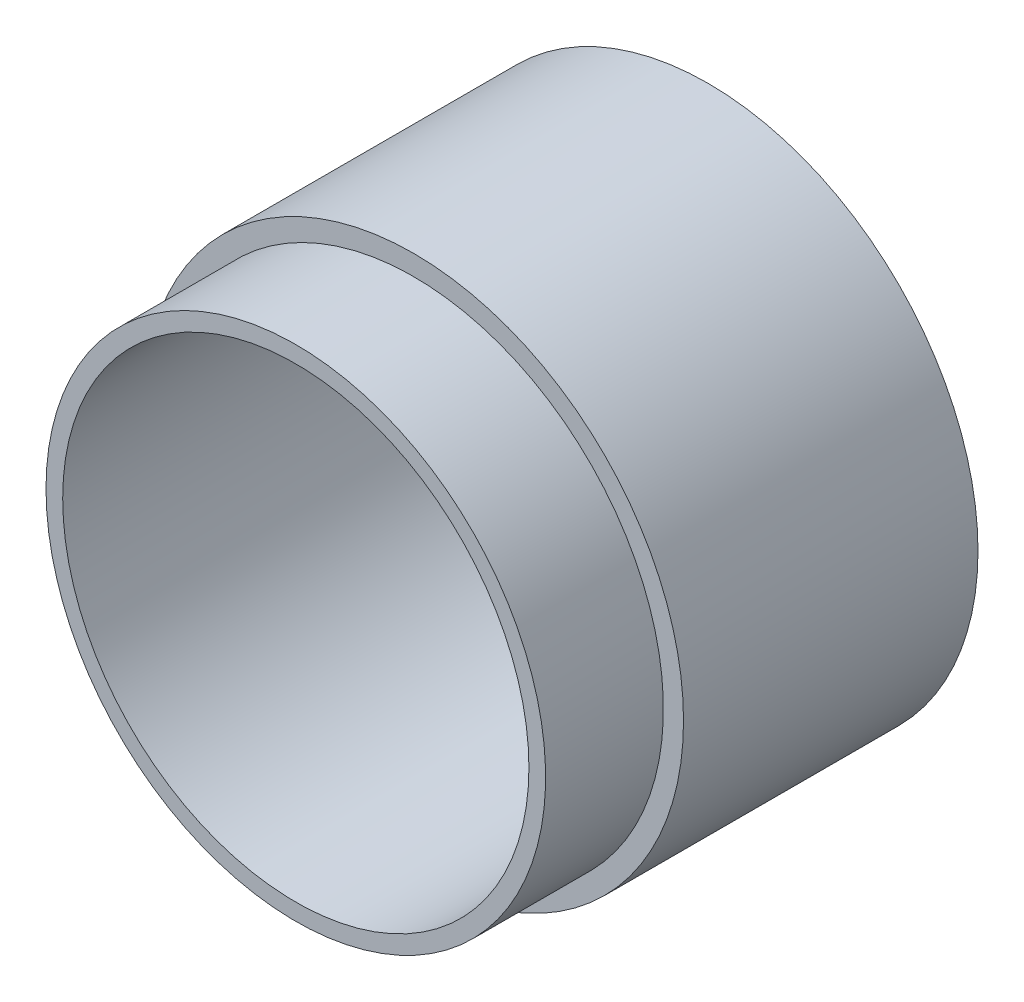
ISO-10303-21;
HEADER;
FILE_DESCRIPTION(('STEP AP214'),'2;1');
FILE_NAME('part.step','',(''),(''),'','','');
FILE_SCHEMA(('AUTOMOTIVE_DESIGN { 1 0 10303 214 1 1 1 1 }'));
ENDSEC;
DATA;
#1=APPLICATION_CONTEXT('core data for automotive mechanical design processes');
#2=APPLICATION_PROTOCOL_DEFINITION('international standard','automotive_design',2000,#1);
#3=PRODUCT_CONTEXT('',#1,'mechanical');
#4=PRODUCT('Part','Part','',(#3));
#5=PRODUCT_RELATED_PRODUCT_CATEGORY('part','',(#4));
#6=PRODUCT_DEFINITION_FORMATION('','',#4);
#7=PRODUCT_DEFINITION_CONTEXT('part definition',#1,'design');
#8=PRODUCT_DEFINITION('design','',#6,#7);
#9=PRODUCT_DEFINITION_SHAPE('','',#8);
#10=(LENGTH_UNIT() NAMED_UNIT(*) SI_UNIT(.MILLI.,.METRE.));
#11=(NAMED_UNIT(*) PLANE_ANGLE_UNIT() SI_UNIT($,.RADIAN.));
#12=(NAMED_UNIT(*) SI_UNIT($,.STERADIAN.) SOLID_ANGLE_UNIT());
#13=UNCERTAINTY_MEASURE_WITH_UNIT(LENGTH_MEASURE(1.E-05),#10,'distance_accuracy_value','');
#14=(GEOMETRIC_REPRESENTATION_CONTEXT(3) GLOBAL_UNCERTAINTY_ASSIGNED_CONTEXT((#13)) GLOBAL_UNIT_ASSIGNED_CONTEXT((#10,
#11,#12)) REPRESENTATION_CONTEXT('',''));
#15=CARTESIAN_POINT('',(0.,0.,0.));
#16=DIRECTION('',(0.,0.,1.));
#17=DIRECTION('',(1.,0.,0.));
#18=AXIS2_PLACEMENT_3D('',#15,#16,#17);
#19=CARTESIAN_POINT('',(0.,0.,15.24));
#20=DIRECTION('',(0.,0.,1.));
#21=DIRECTION('',(1.,0.,0.));
#22=AXIS2_PLACEMENT_3D('',#19,#20,#21);
#23=PLANE('',#22);
#24=CARTESIAN_POINT('',(0.,0.,15.24));
#25=DIRECTION('',(0.,0.,1.));
#26=DIRECTION('',(1.,0.,0.));
#27=AXIS2_PLACEMENT_3D('',#24,#25,#26);
#28=CIRCLE('',#27,13.97);
#29=CARTESIAN_POINT('',(-13.97,0.,15.24));
#30=VERTEX_POINT('',#29);
#31=EDGE_CURVE('E10',#30,#30,#28,.T.);
#32=ORIENTED_EDGE('',*,*,#31,.T.);
#33=EDGE_LOOP('',(#32));
#34=FACE_BOUND('',#33,.T.);
#35=CARTESIAN_POINT('',(0.,0.,15.24));
#36=DIRECTION('',(0.,0.,1.));
#37=DIRECTION('',(1.,0.,0.));
#38=AXIS2_PLACEMENT_3D('',#35,#36,#37);
#39=CIRCLE('',#38,12.9286);
#40=CARTESIAN_POINT('',(-12.9286,0.,15.24));
#41=VERTEX_POINT('',#40);
#42=EDGE_CURVE('E68',#41,#41,#39,.T.);
#43=ORIENTED_EDGE('',*,*,#42,.F.);
#44=EDGE_LOOP('',(#43));
#45=FACE_BOUND('',#44,.T.);
#46=ADVANCED_FACE('F43',(#34,#45),#23,.T.);
#47=CARTESIAN_POINT('',(0.,0.,15.24));
#48=DIRECTION('',(0.,0.,-1.));
#49=DIRECTION('',(-1.,0.,0.));
#50=AXIS2_PLACEMENT_3D('',#47,#48,#49);
#51=CYLINDRICAL_SURFACE('',#50,12.065);
#52=CARTESIAN_POINT('',(0.,0.,1.27));
#53=DIRECTION('',(0.,0.,-1.));
#54=DIRECTION('',(-1.,0.,0.));
#55=AXIS2_PLACEMENT_3D('',#52,#53,#54);
#56=CIRCLE('',#55,12.065);
#57=CARTESIAN_POINT('',(-12.065,0.,1.27));
#58=VERTEX_POINT('',#57);
#59=EDGE_CURVE('E47',#58,#58,#56,.T.);
#60=CARTESIAN_POINT('',(0.,0.,21.336));
#61=DIRECTION('',(0.,0.,1.));
#62=DIRECTION('',(1.,0.,0.));
#63=AXIS2_PLACEMENT_3D('',#60,#61,#62);
#64=CIRCLE('',#63,12.065);
#65=CARTESIAN_POINT('',(-12.065,0.,21.336));
#66=VERTEX_POINT('',#65);
#67=EDGE_CURVE('E72',#66,#66,#64,.T.);
#68=CARTESIAN_POINT('',(-12.065,0.,1.27));
#69=CARTESIAN_POINT('',(-12.065,0.,1.47902083333333));
#70=CARTESIAN_POINT('',(-12.065,0.,1.68804166666667));
#71=CARTESIAN_POINT('',(-12.065,0.,2.10608333333333));
#72=CARTESIAN_POINT('',(-12.065,0.,2.31510416666667));
#73=CARTESIAN_POINT('',(-12.065,0.,2.73314583333333));
#74=CARTESIAN_POINT('',(-12.065,0.,2.94216666666667));
#75=CARTESIAN_POINT('',(-12.065,0.,3.36020833333333));
#76=CARTESIAN_POINT('',(-12.065,0.,3.56922916666667));
#77=CARTESIAN_POINT('',(-12.065,0.,3.98727083333333));
#78=CARTESIAN_POINT('',(-12.065,0.,4.19629166666667));
#79=CARTESIAN_POINT('',(-12.065,0.,4.61433333333333));
#80=CARTESIAN_POINT('',(-12.065,0.,4.82335416666667));
#81=CARTESIAN_POINT('',(-12.065,0.,5.24139583333333));
#82=CARTESIAN_POINT('',(-12.065,0.,5.45041666666667));
#83=CARTESIAN_POINT('',(-12.065,0.,5.86845833333333));
#84=CARTESIAN_POINT('',(-12.065,0.,6.07747916666667));
#85=CARTESIAN_POINT('',(-12.065,0.,6.49552083333333));
#86=CARTESIAN_POINT('',(-12.065,0.,6.70454166666667));
#87=CARTESIAN_POINT('',(-12.065,0.,7.12258333333333));
#88=CARTESIAN_POINT('',(-12.065,0.,7.33160416666667));
#89=CARTESIAN_POINT('',(-12.065,0.,7.74964583333333));
#90=CARTESIAN_POINT('',(-12.065,0.,7.95866666666667));
#91=CARTESIAN_POINT('',(-12.065,0.,8.37670833333333));
#92=CARTESIAN_POINT('',(-12.065,0.,8.58572916666667));
#93=CARTESIAN_POINT('',(-12.065,0.,9.00377083333333));
#94=CARTESIAN_POINT('',(-12.065,0.,9.21279166666667));
#95=CARTESIAN_POINT('',(-12.065,0.,9.63083333333333));
#96=CARTESIAN_POINT('',(-12.065,0.,9.83985416666667));
#97=CARTESIAN_POINT('',(-12.065,0.,10.2578958333333));
#98=CARTESIAN_POINT('',(-12.065,0.,10.4669166666667));
#99=CARTESIAN_POINT('',(-12.065,0.,10.8849583333333));
#100=CARTESIAN_POINT('',(-12.065,0.,11.0939791666667));
#101=CARTESIAN_POINT('',(-12.065,0.,11.5120208333333));
#102=CARTESIAN_POINT('',(-12.065,0.,11.7210416666667));
#103=CARTESIAN_POINT('',(-12.065,0.,12.1390833333333));
#104=CARTESIAN_POINT('',(-12.065,0.,12.3481041666667));
#105=CARTESIAN_POINT('',(-12.065,0.,12.7661458333333));
#106=CARTESIAN_POINT('',(-12.065,0.,12.9751666666667));
#107=CARTESIAN_POINT('',(-12.065,0.,13.3932083333333));
#108=CARTESIAN_POINT('',(-12.065,0.,13.6022291666667));
#109=CARTESIAN_POINT('',(-12.065,0.,14.0202708333333));
#110=CARTESIAN_POINT('',(-12.065,0.,14.2292916666667));
#111=CARTESIAN_POINT('',(-12.065,0.,14.6473333333333));
#112=CARTESIAN_POINT('',(-12.065,0.,14.8563541666667));
#113=CARTESIAN_POINT('',(-12.065,0.,15.2743958333333));
#114=CARTESIAN_POINT('',(-12.065,0.,15.4834166666667));
#115=CARTESIAN_POINT('',(-12.065,0.,15.9014583333333));
#116=CARTESIAN_POINT('',(-12.065,0.,16.1104791666667));
#117=CARTESIAN_POINT('',(-12.065,0.,16.5285208333333));
#118=CARTESIAN_POINT('',(-12.065,0.,16.7375416666667));
#119=CARTESIAN_POINT('',(-12.065,0.,17.1555833333333));
#120=CARTESIAN_POINT('',(-12.065,0.,17.3646041666667));
#121=CARTESIAN_POINT('',(-12.065,0.,17.7826458333333));
#122=CARTESIAN_POINT('',(-12.065,0.,17.9916666666667));
#123=CARTESIAN_POINT('',(-12.065,0.,18.4097083333333));
#124=CARTESIAN_POINT('',(-12.065,0.,18.6187291666667));
#125=CARTESIAN_POINT('',(-12.065,0.,19.0367708333333));
#126=CARTESIAN_POINT('',(-12.065,0.,19.2457916666667));
#127=CARTESIAN_POINT('',(-12.065,0.,19.6638333333333));
#128=CARTESIAN_POINT('',(-12.065,0.,19.8728541666667));
#129=CARTESIAN_POINT('',(-12.065,0.,20.2908958333333));
#130=CARTESIAN_POINT('',(-12.065,0.,20.4999166666667));
#131=CARTESIAN_POINT('',(-12.065,0.,20.9179583333333));
#132=CARTESIAN_POINT('',(-12.065,0.,21.1269791666667));
#133=CARTESIAN_POINT('',(-12.065,0.,21.336));
#134=B_SPLINE_CURVE_WITH_KNOTS('',3,(#68,#69,#70,#71,#72,#73,#74,#75,#76,#77,#78,#79,#80,#81,
#82,#83,#84,#85,#86,#87,#88,#89,#90,#91,#92,#93,#94,#95,#96,#97,#98,#99,#100,#101,#102,#103,
#104,#105,#106,#107,#108,#109,#110,#111,#112,#113,#114,#115,#116,#117,#118,#119,#120,#121,#122,
#123,#124,#125,#126,#127,#128,#129,#130,#131,#132,#133),.UNSPECIFIED.,.F.,.F.,(4,2,2,2,2,2,2,2,
2,2,2,2,2,2,2,2,2,2,2,2,2,2,2,2,2,2,2,2,2,2,2,2,4),(0.,0.627062500000001,1.254125,1.8811875,
2.50825,3.1353125,3.762375,4.3894375,5.0165,5.6435625,6.270625,6.8976875,7.52475,8.1518125,
8.778875,9.4059375,10.033,10.6600625,11.287125,11.9141875,12.54125,13.1683125,13.795375,
14.4224375,15.0495,15.6765625,16.303625,16.9306875,17.55775,18.1848125,18.811875,19.4389375,
20.066),.UNSPECIFIED.);
#135=EDGE_CURVE('BSEAM80',#58,#66,#134,.T.);
#136=ORIENTED_EDGE('',*,*,#59,.T.);
#137=ORIENTED_EDGE('',*,*,#67,.T.);
#138=ORIENTED_EDGE('',*,*,#135,.T.);
#139=ORIENTED_EDGE('',*,*,#135,.F.);
#140=EDGE_LOOP('',(#136,#138,#137,#139));
#141=FACE_BOUND('',#140,.T.);
#142=ADVANCED_FACE('F80',(#141),#51,.F.);
#143=CARTESIAN_POINT('',(0.,0.,0.));
#144=DIRECTION('',(0.,0.,1.));
#145=DIRECTION('',(1.,0.,0.));
#146=AXIS2_PLACEMENT_3D('',#143,#144,#145);
#147=PLANE('',#146);
#148=CARTESIAN_POINT('',(0.,0.,0.));
#149=DIRECTION('',(0.,0.,1.));
#150=DIRECTION('',(1.,0.,0.));
#151=AXIS2_PLACEMENT_3D('',#148,#149,#150);
#152=CIRCLE('',#151,13.97);
#153=CARTESIAN_POINT('',(-13.97,0.,0.));
#154=VERTEX_POINT('',#153);
#155=EDGE_CURVE('E52',#154,#154,#152,.T.);
#156=ORIENTED_EDGE('',*,*,#155,.F.);
#157=EDGE_LOOP('',(#156));
#158=FACE_BOUND('',#157,.T.);
#159=CARTESIAN_POINT('',(0.,0.,0.));
#160=DIRECTION('',(0.,0.,-1.));
#161=DIRECTION('',(-1.,0.,0.));
#162=AXIS2_PLACEMENT_3D('',#159,#160,#161);
#163=CIRCLE('',#162,3.175);
#164=CARTESIAN_POINT('',(-3.175,0.,0.));
#165=VERTEX_POINT('',#164);
#166=EDGE_CURVE('E59',#165,#165,#163,.T.);
#167=ORIENTED_EDGE('',*,*,#166,.F.);
#168=EDGE_LOOP('',(#167));
#169=FACE_BOUND('',#168,.T.);
#170=ADVANCED_FACE('F102',(#158,#169),#147,.F.);
#171=CARTESIAN_POINT('',(0.,0.,15.24));
#172=DIRECTION('',(0.,0.,-1.));
#173=DIRECTION('',(-1.,0.,0.));
#174=AXIS2_PLACEMENT_3D('',#171,#172,#173);
#175=CYLINDRICAL_SURFACE('',#174,13.97);
#176=CARTESIAN_POINT('',(-13.97,0.,0.));
#177=CARTESIAN_POINT('',(-13.97,0.,0.15875));
#178=CARTESIAN_POINT('',(-13.97,0.,0.3175));
#179=CARTESIAN_POINT('',(-13.97,0.,0.635));
#180=CARTESIAN_POINT('',(-13.97,0.,0.79375));
#181=CARTESIAN_POINT('',(-13.97,0.,1.11125));
#182=CARTESIAN_POINT('',(-13.97,0.,1.27));
#183=CARTESIAN_POINT('',(-13.97,0.,1.5875));
#184=CARTESIAN_POINT('',(-13.97,0.,1.74625));
#185=CARTESIAN_POINT('',(-13.97,0.,2.06375));
#186=CARTESIAN_POINT('',(-13.97,0.,2.2225));
#187=CARTESIAN_POINT('',(-13.97,0.,2.54));
#188=CARTESIAN_POINT('',(-13.97,0.,2.69875));
#189=CARTESIAN_POINT('',(-13.97,0.,3.01625));
#190=CARTESIAN_POINT('',(-13.97,0.,3.175));
#191=CARTESIAN_POINT('',(-13.97,0.,3.4925));
#192=CARTESIAN_POINT('',(-13.97,0.,3.65125));
#193=CARTESIAN_POINT('',(-13.97,0.,3.96875));
#194=CARTESIAN_POINT('',(-13.97,0.,4.1275));
#195=CARTESIAN_POINT('',(-13.97,0.,4.445));
#196=CARTESIAN_POINT('',(-13.97,0.,4.60375));
#197=CARTESIAN_POINT('',(-13.97,0.,4.92125));
#198=CARTESIAN_POINT('',(-13.97,0.,5.08));
#199=CARTESIAN_POINT('',(-13.97,0.,5.3975));
#200=CARTESIAN_POINT('',(-13.97,0.,5.55625));
#201=CARTESIAN_POINT('',(-13.97,0.,5.87375));
#202=CARTESIAN_POINT('',(-13.97,0.,6.0325));
#203=CARTESIAN_POINT('',(-13.97,0.,6.35));
#204=CARTESIAN_POINT('',(-13.97,0.,6.50875));
#205=CARTESIAN_POINT('',(-13.97,0.,6.82625));
#206=CARTESIAN_POINT('',(-13.97,0.,6.985));
#207=CARTESIAN_POINT('',(-13.97,0.,7.3025));
#208=CARTESIAN_POINT('',(-13.97,0.,7.46125));
#209=CARTESIAN_POINT('',(-13.97,0.,7.77875));
#210=CARTESIAN_POINT('',(-13.97,0.,7.9375));
#211=CARTESIAN_POINT('',(-13.97,0.,8.255));
#212=CARTESIAN_POINT('',(-13.97,0.,8.41375));
#213=CARTESIAN_POINT('',(-13.97,0.,8.73125));
#214=CARTESIAN_POINT('',(-13.97,0.,8.89));
#215=CARTESIAN_POINT('',(-13.97,0.,9.2075));
#216=CARTESIAN_POINT('',(-13.97,0.,9.36625));
#217=CARTESIAN_POINT('',(-13.97,0.,9.68375));
#218=CARTESIAN_POINT('',(-13.97,0.,9.8425));
#219=CARTESIAN_POINT('',(-13.97,0.,10.16));
#220=CARTESIAN_POINT('',(-13.97,0.,10.31875));
#221=CARTESIAN_POINT('',(-13.97,0.,10.63625));
#222=CARTESIAN_POINT('',(-13.97,0.,10.795));
#223=CARTESIAN_POINT('',(-13.97,0.,11.1125));
#224=CARTESIAN_POINT('',(-13.97,0.,11.27125));
#225=CARTESIAN_POINT('',(-13.97,0.,11.58875));
#226=CARTESIAN_POINT('',(-13.97,0.,11.7475));
#227=CARTESIAN_POINT('',(-13.97,0.,12.065));
#228=CARTESIAN_POINT('',(-13.97,0.,12.22375));
#229=CARTESIAN_POINT('',(-13.97,0.,12.54125));
#230=CARTESIAN_POINT('',(-13.97,0.,12.7));
#231=CARTESIAN_POINT('',(-13.97,0.,13.0175));
#232=CARTESIAN_POINT('',(-13.97,0.,13.17625));
#233=CARTESIAN_POINT('',(-13.97,0.,13.49375));
#234=CARTESIAN_POINT('',(-13.97,0.,13.6525));
#235=CARTESIAN_POINT('',(-13.97,0.,13.97));
#236=CARTESIAN_POINT('',(-13.97,0.,14.12875));
#237=CARTESIAN_POINT('',(-13.97,0.,14.44625));
#238=CARTESIAN_POINT('',(-13.97,0.,14.605));
#239=CARTESIAN_POINT('',(-13.97,0.,14.9225));
#240=CARTESIAN_POINT('',(-13.97,0.,15.08125));
#241=CARTESIAN_POINT('',(-13.97,0.,15.24));
#242=B_SPLINE_CURVE_WITH_KNOTS('',3,(#176,#177,#178,#179,#180,#181,#182,#183,#184,#185,#186,
#187,#188,#189,#190,#191,#192,#193,#194,#195,#196,#197,#198,#199,#200,#201,#202,#203,#204,#205,
#206,#207,#208,#209,#210,#211,#212,#213,#214,#215,#216,#217,#218,#219,#220,#221,#222,#223,#224,
#225,#226,#227,#228,#229,#230,#231,#232,#233,#234,#235,#236,#237,#238,#239,#240,#241),
.UNSPECIFIED.,.F.,.F.,(4,2,2,2,2,2,2,2,2,2,2,2,2,2,2,2,2,2,2,2,2,2,2,2,2,2,2,2,2,2,2,2,4),(0.,
0.476249999999999,0.9525,1.42875,1.905,2.38125,2.8575,3.33375,3.81,4.28625,4.7625,5.23875,5.715,
6.19125,6.6675,7.14375,7.62,8.09625,8.5725,9.04875,9.525,10.00125,10.4775,10.95375,11.43,
11.90625,12.3825,12.85875,13.335,13.81125,14.2875,14.76375,15.24),.UNSPECIFIED.);
#243=EDGE_CURVE('BSEAM45',#154,#30,#242,.T.);
#244=ORIENTED_EDGE('',*,*,#155,.T.);
#245=ORIENTED_EDGE('',*,*,#31,.F.);
#246=ORIENTED_EDGE('',*,*,#243,.T.);
#247=ORIENTED_EDGE('',*,*,#243,.F.);
#248=EDGE_LOOP('',(#244,#246,#245,#247));
#249=FACE_BOUND('',#248,.T.);
#250=ADVANCED_FACE('F45',(#249),#175,.T.);
#251=CARTESIAN_POINT('',(0.,0.,1.27));
#252=DIRECTION('',(0.,0.,-1.));
#253=DIRECTION('',(-1.,0.,0.));
#254=AXIS2_PLACEMENT_3D('',#251,#252,#253);
#255=PLANE('',#254);
#256=CARTESIAN_POINT('',(0.,0.,1.27));
#257=DIRECTION('',(0.,0.,-1.));
#258=DIRECTION('',(-1.,0.,0.));
#259=AXIS2_PLACEMENT_3D('',#256,#257,#258);
#260=CIRCLE('',#259,3.175);
#261=CARTESIAN_POINT('',(-3.175,0.,1.27));
#262=VERTEX_POINT('',#261);
#263=EDGE_CURVE('E63',#262,#262,#260,.T.);
#264=ORIENTED_EDGE('',*,*,#263,.T.);
#265=EDGE_LOOP('',(#264));
#266=FACE_BOUND('',#265,.T.);
#267=ORIENTED_EDGE('',*,*,#59,.F.);
#268=EDGE_LOOP('',(#267));
#269=FACE_BOUND('',#268,.T.);
#270=ADVANCED_FACE('F95',(#266,#269),#255,.F.);
#271=CARTESIAN_POINT('',(0.,0.,1.27));
#272=DIRECTION('',(0.,0.,-1.));
#273=DIRECTION('',(-1.,0.,0.));
#274=AXIS2_PLACEMENT_3D('',#271,#272,#273);
#275=CYLINDRICAL_SURFACE('',#274,3.175);
#276=ORIENTED_EDGE('',*,*,#263,.F.);
#277=EDGE_LOOP('',(#276));
#278=FACE_BOUND('',#277,.T.);
#279=ORIENTED_EDGE('',*,*,#166,.T.);
#280=EDGE_LOOP('',(#279));
#281=FACE_BOUND('',#280,.T.);
#282=ADVANCED_FACE('F85',(#278,#281),#275,.F.);
#283=CARTESIAN_POINT('',(0.,0.,21.336));
#284=DIRECTION('',(0.,0.,1.));
#285=DIRECTION('',(1.,0.,0.));
#286=AXIS2_PLACEMENT_3D('',#283,#284,#285);
#287=PLANE('',#286);
#288=CARTESIAN_POINT('',(0.,0.,21.336));
#289=DIRECTION('',(0.,0.,1.));
#290=DIRECTION('',(1.,0.,0.));
#291=AXIS2_PLACEMENT_3D('',#288,#289,#290);
#292=CIRCLE('',#291,12.9286);
#293=CARTESIAN_POINT('',(-12.9286,0.,21.336));
#294=VERTEX_POINT('',#293);
#295=EDGE_CURVE('E64',#294,#294,#292,.T.);
#296=ORIENTED_EDGE('',*,*,#295,.T.);
#297=EDGE_LOOP('',(#296));
#298=FACE_BOUND('',#297,.T.);
#299=ORIENTED_EDGE('',*,*,#67,.F.);
#300=EDGE_LOOP('',(#299));
#301=FACE_BOUND('',#300,.T.);
#302=ADVANCED_FACE('F82',(#298,#301),#287,.T.);
#303=CARTESIAN_POINT('',(0.,0.,21.336));
#304=DIRECTION('',(0.,0.,-1.));
#305=DIRECTION('',(-1.,0.,0.));
#306=AXIS2_PLACEMENT_3D('',#303,#304,#305);
#307=CYLINDRICAL_SURFACE('',#306,12.9286);
#308=CARTESIAN_POINT('',(-12.9286,0.,21.336));
#309=CARTESIAN_POINT('',(-12.9286,0.,21.2725));
#310=CARTESIAN_POINT('',(-12.9286,0.,21.209));
#311=CARTESIAN_POINT('',(-12.9286,0.,21.082));
#312=CARTESIAN_POINT('',(-12.9286,0.,21.0185));
#313=CARTESIAN_POINT('',(-12.9286,0.,20.8915));
#314=CARTESIAN_POINT('',(-12.9286,0.,20.828));
#315=CARTESIAN_POINT('',(-12.9286,0.,20.701));
#316=CARTESIAN_POINT('',(-12.9286,0.,20.6375));
#317=CARTESIAN_POINT('',(-12.9286,0.,20.5105));
#318=CARTESIAN_POINT('',(-12.9286,0.,20.447));
#319=CARTESIAN_POINT('',(-12.9286,0.,20.32));
#320=CARTESIAN_POINT('',(-12.9286,0.,20.2565));
#321=CARTESIAN_POINT('',(-12.9286,0.,20.1295));
#322=CARTESIAN_POINT('',(-12.9286,0.,20.066));
#323=CARTESIAN_POINT('',(-12.9286,0.,19.939));
#324=CARTESIAN_POINT('',(-12.9286,0.,19.8755));
#325=CARTESIAN_POINT('',(-12.9286,0.,19.7485));
#326=CARTESIAN_POINT('',(-12.9286,0.,19.685));
#327=CARTESIAN_POINT('',(-12.9286,0.,19.558));
#328=CARTESIAN_POINT('',(-12.9286,0.,19.4945));
#329=CARTESIAN_POINT('',(-12.9286,0.,19.3675));
#330=CARTESIAN_POINT('',(-12.9286,0.,19.304));
#331=CARTESIAN_POINT('',(-12.9286,0.,19.177));
#332=CARTESIAN_POINT('',(-12.9286,0.,19.1135));
#333=CARTESIAN_POINT('',(-12.9286,0.,18.9865));
#334=CARTESIAN_POINT('',(-12.9286,0.,18.923));
#335=CARTESIAN_POINT('',(-12.9286,0.,18.796));
#336=CARTESIAN_POINT('',(-12.9286,0.,18.7325));
#337=CARTESIAN_POINT('',(-12.9286,0.,18.6055));
#338=CARTESIAN_POINT('',(-12.9286,0.,18.542));
#339=CARTESIAN_POINT('',(-12.9286,0.,18.415));
#340=CARTESIAN_POINT('',(-12.9286,0.,18.3515));
#341=CARTESIAN_POINT('',(-12.9286,0.,18.2245));
#342=CARTESIAN_POINT('',(-12.9286,0.,18.161));
#343=CARTESIAN_POINT('',(-12.9286,0.,18.034));
#344=CARTESIAN_POINT('',(-12.9286,0.,17.9705));
#345=CARTESIAN_POINT('',(-12.9286,0.,17.8435));
#346=CARTESIAN_POINT('',(-12.9286,0.,17.78));
#347=CARTESIAN_POINT('',(-12.9286,0.,17.653));
#348=CARTESIAN_POINT('',(-12.9286,0.,17.5895));
#349=CARTESIAN_POINT('',(-12.9286,0.,17.4625));
#350=CARTESIAN_POINT('',(-12.9286,0.,17.399));
#351=CARTESIAN_POINT('',(-12.9286,0.,17.272));
#352=CARTESIAN_POINT('',(-12.9286,0.,17.2085));
#353=CARTESIAN_POINT('',(-12.9286,0.,17.0815));
#354=CARTESIAN_POINT('',(-12.9286,0.,17.018));
#355=CARTESIAN_POINT('',(-12.9286,0.,16.891));
#356=CARTESIAN_POINT('',(-12.9286,0.,16.8275));
#357=CARTESIAN_POINT('',(-12.9286,0.,16.7005));
#358=CARTESIAN_POINT('',(-12.9286,0.,16.637));
#359=CARTESIAN_POINT('',(-12.9286,0.,16.51));
#360=CARTESIAN_POINT('',(-12.9286,0.,16.4465));
#361=CARTESIAN_POINT('',(-12.9286,0.,16.3195));
#362=CARTESIAN_POINT('',(-12.9286,0.,16.256));
#363=CARTESIAN_POINT('',(-12.9286,0.,16.129));
#364=CARTESIAN_POINT('',(-12.9286,0.,16.0655));
#365=CARTESIAN_POINT('',(-12.9286,0.,15.9385));
#366=CARTESIAN_POINT('',(-12.9286,0.,15.875));
#367=CARTESIAN_POINT('',(-12.9286,0.,15.748));
#368=CARTESIAN_POINT('',(-12.9286,0.,15.6845));
#369=CARTESIAN_POINT('',(-12.9286,0.,15.5575));
#370=CARTESIAN_POINT('',(-12.9286,0.,15.494));
#371=CARTESIAN_POINT('',(-12.9286,0.,15.367));
#372=CARTESIAN_POINT('',(-12.9286,0.,15.3035));
#373=CARTESIAN_POINT('',(-12.9286,0.,15.24));
#374=B_SPLINE_CURVE_WITH_KNOTS('',3,(#308,#309,#310,#311,#312,#313,#314,#315,#316,#317,#318,
#319,#320,#321,#322,#323,#324,#325,#326,#327,#328,#329,#330,#331,#332,#333,#334,#335,#336,#337,
#338,#339,#340,#341,#342,#343,#344,#345,#346,#347,#348,#349,#350,#351,#352,#353,#354,#355,#356,
#357,#358,#359,#360,#361,#362,#363,#364,#365,#366,#367,#368,#369,#370,#371,#372,#373),
.UNSPECIFIED.,.F.,.F.,(4,2,2,2,2,2,2,2,2,2,2,2,2,2,2,2,2,2,2,2,2,2,2,2,2,2,2,2,2,2,2,2,4),(0.,
0.190500000000003,0.381000000000003,0.571500000000003,0.762000000000002,0.952500000000002,1.143,
1.3335,1.524,1.7145,1.905,2.0955,2.286,2.4765,2.667,2.8575,3.048,3.2385,3.429,3.6195,3.81,
4.0005,4.191,4.3815,4.572,4.7625,4.953,5.1435,5.334,5.5245,5.715,5.9055,6.096),.UNSPECIFIED.);
#375=EDGE_CURVE('BSEAM84',#294,#41,#374,.T.);
#376=ORIENTED_EDGE('',*,*,#295,.F.);
#377=ORIENTED_EDGE('',*,*,#42,.T.);
#378=ORIENTED_EDGE('',*,*,#375,.T.);
#379=ORIENTED_EDGE('',*,*,#375,.F.);
#380=EDGE_LOOP('',(#376,#378,#377,#379));
#381=FACE_BOUND('',#380,.T.);
#382=ADVANCED_FACE('F84',(#381),#307,.T.);
#383=CLOSED_SHELL('',(#46,#142,#170,#250,#270,#282,#302,#382));
#384=MANIFOLD_SOLID_BREP('B2',#383);
#385=ADVANCED_BREP_SHAPE_REPRESENTATION('',(#18,#384),#14);
#386=SHAPE_DEFINITION_REPRESENTATION(#9,#385);
ENDSEC;
END-ISO-10303-21;
